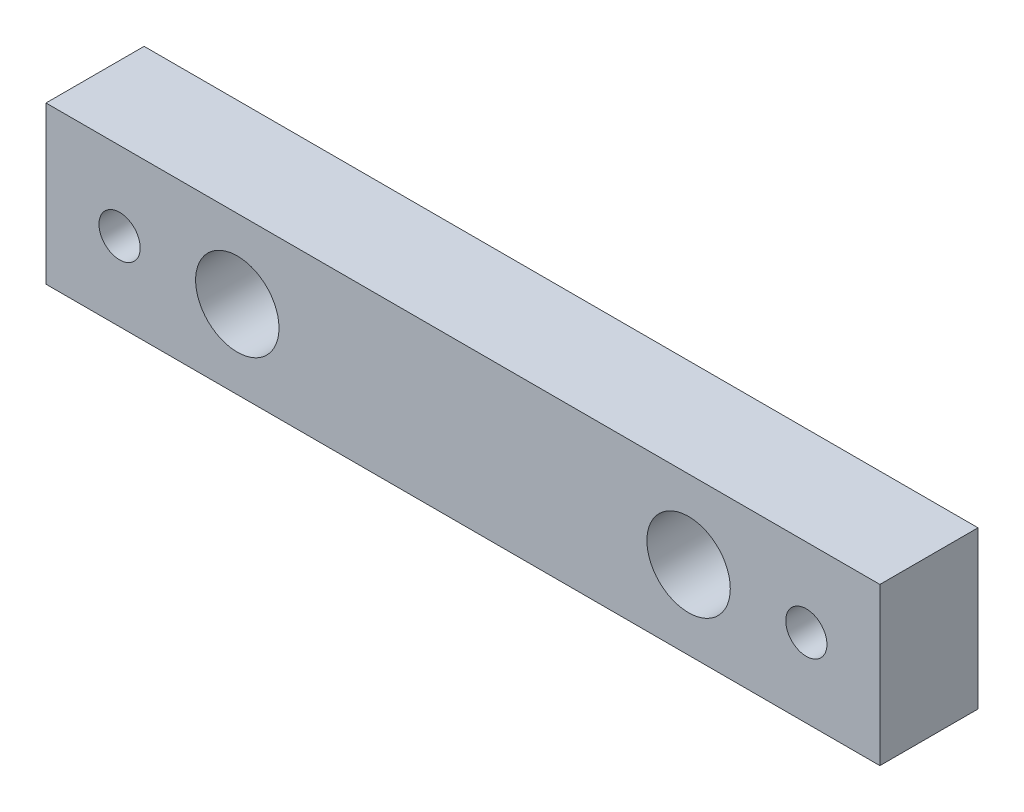
ISO-10303-21;
HEADER;
FILE_DESCRIPTION(('STEP AP214'),'2;1');
FILE_NAME('part.step','',(''),(''),'','','');
FILE_SCHEMA(('AUTOMOTIVE_DESIGN { 1 0 10303 214 1 1 1 1 }'));
ENDSEC;
DATA;
#1=APPLICATION_CONTEXT('core data for automotive mechanical design processes');
#2=APPLICATION_PROTOCOL_DEFINITION('international standard','automotive_design',2000,#1);
#3=PRODUCT_CONTEXT('',#1,'mechanical');
#4=PRODUCT('Part','Part','',(#3));
#5=PRODUCT_RELATED_PRODUCT_CATEGORY('part','',(#4));
#6=PRODUCT_DEFINITION_FORMATION('','',#4);
#7=PRODUCT_DEFINITION_CONTEXT('part definition',#1,'design');
#8=PRODUCT_DEFINITION('design','',#6,#7);
#9=PRODUCT_DEFINITION_SHAPE('','',#8);
#10=(LENGTH_UNIT() NAMED_UNIT(*) SI_UNIT(.MILLI.,.METRE.));
#11=(NAMED_UNIT(*) PLANE_ANGLE_UNIT() SI_UNIT($,.RADIAN.));
#12=(NAMED_UNIT(*) SI_UNIT($,.STERADIAN.) SOLID_ANGLE_UNIT());
#13=UNCERTAINTY_MEASURE_WITH_UNIT(LENGTH_MEASURE(1.E-05),#10,'distance_accuracy_value','');
#14=(GEOMETRIC_REPRESENTATION_CONTEXT(3) GLOBAL_UNCERTAINTY_ASSIGNED_CONTEXT((#13)) GLOBAL_UNIT_ASSIGNED_CONTEXT((#10,
#11,#12)) REPRESENTATION_CONTEXT('',''));
#15=CARTESIAN_POINT('',(0.,0.,0.));
#16=DIRECTION('',(0.,0.,1.));
#17=DIRECTION('',(1.,0.,0.));
#18=AXIS2_PLACEMENT_3D('',#15,#16,#17);
#19=CARTESIAN_POINT('',(0.,0.,10.));
#20=DIRECTION('',(0.,0.,-1.));
#21=DIRECTION('',(-1.,0.,0.));
#22=AXIS2_PLACEMENT_3D('',#19,#20,#21);
#23=PLANE('',#22);
#24=CARTESIAN_POINT('',(-35.,0.,10.));
#25=DIRECTION('',(0.,0.,1.));
#26=DIRECTION('',(1.,0.,0.));
#27=AXIS2_PLACEMENT_3D('',#24,#25,#26);
#28=CIRCLE('',#27,2.09999999999999);
#29=CARTESIAN_POINT('',(-32.9,0.,10.));
#30=VERTEX_POINT('',#29);
#31=EDGE_CURVE('E132',#30,#30,#28,.T.);
#32=ORIENTED_EDGE('',*,*,#31,.F.);
#33=EDGE_LOOP('',(#32));
#34=FACE_BOUND('',#33,.T.);
#35=CARTESIAN_POINT('',(35.,0.,10.));
#36=DIRECTION('',(0.,0.,1.));
#37=DIRECTION('',(1.,0.,0.));
#38=AXIS2_PLACEMENT_3D('',#35,#36,#37);
#39=CIRCLE('',#38,2.09999999999999);
#40=CARTESIAN_POINT('',(37.1,0.,10.));
#41=VERTEX_POINT('',#40);
#42=EDGE_CURVE('E129',#41,#41,#39,.T.);
#43=ORIENTED_EDGE('',*,*,#42,.F.);
#44=EDGE_LOOP('',(#43));
#45=FACE_BOUND('',#44,.T.);
#46=DIRECTION('',(0.,-1.,0.));
#47=VECTOR('',#46,1.);
#48=CARTESIAN_POINT('',(-42.5,7.99999999999999,10.));
#49=LINE('',#48,#47);
#50=CARTESIAN_POINT('',(-42.5,7.99999999999999,10.));
#51=VERTEX_POINT('',#50);
#52=CARTESIAN_POINT('',(-42.5,-8.00000000000001,10.));
#53=VERTEX_POINT('',#52);
#54=EDGE_CURVE('E87',#51,#53,#49,.T.);
#55=ORIENTED_EDGE('',*,*,#54,.T.);
#56=DIRECTION('',(1.,0.,0.));
#57=VECTOR('',#56,1.);
#58=CARTESIAN_POINT('',(42.5,-7.99999999999999,10.));
#59=LINE('',#58,#57);
#60=CARTESIAN_POINT('',(42.5,-7.99999999999999,10.));
#61=VERTEX_POINT('',#60);
#62=EDGE_CURVE('E82',#53,#61,#59,.T.);
#63=ORIENTED_EDGE('',*,*,#62,.T.);
#64=DIRECTION('',(0.,1.,0.));
#65=VECTOR('',#64,1.);
#66=CARTESIAN_POINT('',(42.5,8.00000000000001,10.));
#67=LINE('',#66,#65);
#68=CARTESIAN_POINT('',(42.5,8.00000000000001,10.));
#69=VERTEX_POINT('',#68);
#70=EDGE_CURVE('E85',#61,#69,#67,.T.);
#71=ORIENTED_EDGE('',*,*,#70,.T.);
#72=DIRECTION('',(-1.,0.,0.));
#73=VECTOR('',#72,1.);
#74=CARTESIAN_POINT('',(42.5,8.00000000000001,10.));
#75=LINE('',#74,#73);
#76=EDGE_CURVE('E52',#69,#51,#75,.T.);
#77=ORIENTED_EDGE('',*,*,#76,.T.);
#78=EDGE_LOOP('',(#55,#63,#71,#77));
#79=FACE_BOUND('',#78,.T.);
#80=CARTESIAN_POINT('',(-23.,0.,10.));
#81=DIRECTION('',(0.,0.,1.));
#82=DIRECTION('',(1.,0.,0.));
#83=AXIS2_PLACEMENT_3D('',#80,#81,#82);
#84=CIRCLE('',#83,4.25);
#85=CARTESIAN_POINT('',(-18.75,0.,10.));
#86=VERTEX_POINT('',#85);
#87=EDGE_CURVE('E103',#86,#86,#84,.T.);
#88=ORIENTED_EDGE('',*,*,#87,.F.);
#89=EDGE_LOOP('',(#88));
#90=FACE_BOUND('',#89,.T.);
#91=CARTESIAN_POINT('',(23.,0.,10.));
#92=DIRECTION('',(0.,0.,1.));
#93=DIRECTION('',(1.,0.,0.));
#94=AXIS2_PLACEMENT_3D('',#91,#92,#93);
#95=CIRCLE('',#94,4.25);
#96=CARTESIAN_POINT('',(27.25,0.,10.));
#97=VERTEX_POINT('',#96);
#98=EDGE_CURVE('E118',#97,#97,#95,.T.);
#99=ORIENTED_EDGE('',*,*,#98,.F.);
#100=EDGE_LOOP('',(#99));
#101=FACE_BOUND('',#100,.T.);
#102=ADVANCED_FACE('F34',(#34,#45,#79,#90,#101),#23,.F.);
#103=CARTESIAN_POINT('',(0.,0.,0.));
#104=DIRECTION('',(0.,0.,-1.));
#105=DIRECTION('',(-1.,0.,0.));
#106=AXIS2_PLACEMENT_3D('',#103,#104,#105);
#107=PLANE('',#106);
#108=CARTESIAN_POINT('',(-35.,0.,0.));
#109=DIRECTION('',(0.,0.,-1.));
#110=DIRECTION('',(-1.,0.,0.));
#111=AXIS2_PLACEMENT_3D('',#108,#109,#110);
#112=CIRCLE('',#111,2.09999999999999);
#113=CARTESIAN_POINT('',(-37.1,0.,0.));
#114=VERTEX_POINT('',#113);
#115=EDGE_CURVE('E38',#114,#114,#112,.T.);
#116=ORIENTED_EDGE('',*,*,#115,.F.);
#117=EDGE_LOOP('',(#116));
#118=FACE_BOUND('',#117,.T.);
#119=CARTESIAN_POINT('',(35.,0.,0.));
#120=DIRECTION('',(0.,0.,-1.));
#121=DIRECTION('',(-1.,0.,0.));
#122=AXIS2_PLACEMENT_3D('',#119,#120,#121);
#123=CIRCLE('',#122,2.09999999999999);
#124=CARTESIAN_POINT('',(32.9,0.,0.));
#125=VERTEX_POINT('',#124);
#126=EDGE_CURVE('E124',#125,#125,#123,.T.);
#127=ORIENTED_EDGE('',*,*,#126,.F.);
#128=EDGE_LOOP('',(#127));
#129=FACE_BOUND('',#128,.T.);
#130=CARTESIAN_POINT('',(-23.,0.,0.));
#131=DIRECTION('',(0.,0.,1.));
#132=DIRECTION('',(1.,0.,0.));
#133=AXIS2_PLACEMENT_3D('',#130,#131,#132);
#134=CIRCLE('',#133,4.25);
#135=CARTESIAN_POINT('',(-18.75,0.,0.));
#136=VERTEX_POINT('',#135);
#137=EDGE_CURVE('E115',#136,#136,#134,.T.);
#138=ORIENTED_EDGE('',*,*,#137,.T.);
#139=EDGE_LOOP('',(#138));
#140=FACE_BOUND('',#139,.T.);
#141=DIRECTION('',(0.,-1.,0.));
#142=VECTOR('',#141,1.);
#143=CARTESIAN_POINT('',(-42.5,7.99999999999999,0.));
#144=LINE('',#143,#142);
#145=CARTESIAN_POINT('',(-42.5,7.99999999999999,0.));
#146=VERTEX_POINT('',#145);
#147=CARTESIAN_POINT('',(-42.5,-8.00000000000001,0.));
#148=VERTEX_POINT('',#147);
#149=EDGE_CURVE('E100',#146,#148,#144,.T.);
#150=ORIENTED_EDGE('',*,*,#149,.F.);
#151=DIRECTION('',(-1.,0.,0.));
#152=VECTOR('',#151,1.);
#153=CARTESIAN_POINT('',(42.5,8.00000000000001,0.));
#154=LINE('',#153,#152);
#155=CARTESIAN_POINT('',(42.5,8.00000000000001,0.));
#156=VERTEX_POINT('',#155);
#157=EDGE_CURVE('E75',#156,#146,#154,.T.);
#158=ORIENTED_EDGE('',*,*,#157,.F.);
#159=DIRECTION('',(0.,1.,0.));
#160=VECTOR('',#159,1.);
#161=CARTESIAN_POINT('',(42.5,8.00000000000001,0.));
#162=LINE('',#161,#160);
#163=CARTESIAN_POINT('',(42.5,-7.99999999999999,0.));
#164=VERTEX_POINT('',#163);
#165=EDGE_CURVE('E69',#164,#156,#162,.T.);
#166=ORIENTED_EDGE('',*,*,#165,.F.);
#167=DIRECTION('',(1.,0.,0.));
#168=VECTOR('',#167,1.);
#169=CARTESIAN_POINT('',(42.5,-7.99999999999999,0.));
#170=LINE('',#169,#168);
#171=EDGE_CURVE('E91',#148,#164,#170,.T.);
#172=ORIENTED_EDGE('',*,*,#171,.F.);
#173=EDGE_LOOP('',(#150,#158,#166,#172));
#174=FACE_BOUND('',#173,.T.);
#175=CARTESIAN_POINT('',(23.,0.,0.));
#176=DIRECTION('',(0.,0.,1.));
#177=DIRECTION('',(1.,0.,0.));
#178=AXIS2_PLACEMENT_3D('',#175,#176,#177);
#179=CIRCLE('',#178,4.25);
#180=CARTESIAN_POINT('',(27.25,0.,0.));
#181=VERTEX_POINT('',#180);
#182=EDGE_CURVE('E121',#181,#181,#179,.T.);
#183=ORIENTED_EDGE('',*,*,#182,.T.);
#184=EDGE_LOOP('',(#183));
#185=FACE_BOUND('',#184,.T.);
#186=ADVANCED_FACE('F111',(#118,#129,#140,#174,#185),#107,.T.);
#187=CARTESIAN_POINT('',(-42.5,7.99999999999999,10.));
#188=DIRECTION('',(1.,0.,0.));
#189=DIRECTION('',(0.,0.,-1.));
#190=AXIS2_PLACEMENT_3D('',#187,#188,#189);
#191=PLANE('',#190);
#192=ORIENTED_EDGE('',*,*,#149,.T.);
#193=DIRECTION('',(0.,0.,-1.));
#194=VECTOR('',#193,1.);
#195=CARTESIAN_POINT('',(-42.5,-8.00000000000001,10.));
#196=LINE('',#195,#194);
#197=EDGE_CURVE('E11',#53,#148,#196,.T.);
#198=ORIENTED_EDGE('',*,*,#197,.F.);
#199=ORIENTED_EDGE('',*,*,#54,.F.);
#200=DIRECTION('',(0.,0.,-1.));
#201=VECTOR('',#200,1.);
#202=CARTESIAN_POINT('',(-42.5,7.99999999999999,10.));
#203=LINE('',#202,#201);
#204=EDGE_CURVE('E96',#51,#146,#203,.T.);
#205=ORIENTED_EDGE('',*,*,#204,.T.);
#206=EDGE_LOOP('',(#192,#198,#199,#205));
#207=FACE_BOUND('',#206,.T.);
#208=ADVANCED_FACE('F36',(#207),#191,.F.);
#209=CARTESIAN_POINT('',(42.5,-7.99999999999999,10.));
#210=DIRECTION('',(0.,1.,0.));
#211=DIRECTION('',(-1.,0.,0.));
#212=AXIS2_PLACEMENT_3D('',#209,#210,#211);
#213=PLANE('',#212);
#214=ORIENTED_EDGE('',*,*,#171,.T.);
#215=DIRECTION('',(0.,0.,-1.));
#216=VECTOR('',#215,1.);
#217=CARTESIAN_POINT('',(42.5,-7.99999999999999,10.));
#218=LINE('',#217,#216);
#219=EDGE_CURVE('E44',#61,#164,#218,.T.);
#220=ORIENTED_EDGE('',*,*,#219,.F.);
#221=ORIENTED_EDGE('',*,*,#62,.F.);
#222=ORIENTED_EDGE('',*,*,#197,.T.);
#223=EDGE_LOOP('',(#214,#220,#221,#222));
#224=FACE_BOUND('',#223,.T.);
#225=ADVANCED_FACE('F90',(#224),#213,.F.);
#226=CARTESIAN_POINT('',(42.5,8.00000000000001,10.));
#227=DIRECTION('',(-1.,0.,0.));
#228=DIRECTION('',(0.,0.,1.));
#229=AXIS2_PLACEMENT_3D('',#226,#227,#228);
#230=PLANE('',#229);
#231=ORIENTED_EDGE('',*,*,#165,.T.);
#232=DIRECTION('',(0.,0.,-1.));
#233=VECTOR('',#232,1.);
#234=CARTESIAN_POINT('',(42.5,8.00000000000001,10.));
#235=LINE('',#234,#233);
#236=EDGE_CURVE('E92',#69,#156,#235,.T.);
#237=ORIENTED_EDGE('',*,*,#236,.F.);
#238=ORIENTED_EDGE('',*,*,#70,.F.);
#239=ORIENTED_EDGE('',*,*,#219,.T.);
#240=EDGE_LOOP('',(#231,#237,#238,#239));
#241=FACE_BOUND('',#240,.T.);
#242=ADVANCED_FACE('F94',(#241),#230,.F.);
#243=CARTESIAN_POINT('',(42.5,8.00000000000001,10.));
#244=DIRECTION('',(0.,-1.,0.));
#245=DIRECTION('',(1.,0.,0.));
#246=AXIS2_PLACEMENT_3D('',#243,#244,#245);
#247=PLANE('',#246);
#248=ORIENTED_EDGE('',*,*,#157,.T.);
#249=ORIENTED_EDGE('',*,*,#204,.F.);
#250=ORIENTED_EDGE('',*,*,#76,.F.);
#251=ORIENTED_EDGE('',*,*,#236,.T.);
#252=EDGE_LOOP('',(#248,#249,#250,#251));
#253=FACE_BOUND('',#252,.T.);
#254=ADVANCED_FACE('F108',(#253),#247,.F.);
#255=CARTESIAN_POINT('',(-23.,0.,10.));
#256=DIRECTION('',(0.,0.,-1.));
#257=DIRECTION('',(-1.,0.,0.));
#258=AXIS2_PLACEMENT_3D('',#255,#256,#257);
#259=CYLINDRICAL_SURFACE('',#258,4.25);
#260=ORIENTED_EDGE('',*,*,#87,.T.);
#261=EDGE_LOOP('',(#260));
#262=FACE_BOUND('',#261,.T.);
#263=ORIENTED_EDGE('',*,*,#137,.F.);
#264=EDGE_LOOP('',(#263));
#265=FACE_BOUND('',#264,.T.);
#266=ADVANCED_FACE('F148',(#262,#265),#259,.F.);
#267=CARTESIAN_POINT('',(23.,0.,10.));
#268=DIRECTION('',(0.,0.,-1.));
#269=DIRECTION('',(-1.,0.,0.));
#270=AXIS2_PLACEMENT_3D('',#267,#268,#269);
#271=CYLINDRICAL_SURFACE('',#270,4.25);
#272=ORIENTED_EDGE('',*,*,#98,.T.);
#273=EDGE_LOOP('',(#272));
#274=FACE_BOUND('',#273,.T.);
#275=ORIENTED_EDGE('',*,*,#182,.F.);
#276=EDGE_LOOP('',(#275));
#277=FACE_BOUND('',#276,.T.);
#278=ADVANCED_FACE('F150',(#274,#277),#271,.F.);
#279=CARTESIAN_POINT('',(35.,0.,10.));
#280=DIRECTION('',(0.,0.,1.));
#281=DIRECTION('',(1.,0.,0.));
#282=AXIS2_PLACEMENT_3D('',#279,#280,#281);
#283=CYLINDRICAL_SURFACE('',#282,2.09999999999999);
#284=ORIENTED_EDGE('',*,*,#126,.T.);
#285=EDGE_LOOP('',(#284));
#286=FACE_BOUND('',#285,.T.);
#287=ORIENTED_EDGE('',*,*,#42,.T.);
#288=EDGE_LOOP('',(#287));
#289=FACE_BOUND('',#288,.T.);
#290=ADVANCED_FACE('F157',(#286,#289),#283,.F.);
#291=CARTESIAN_POINT('',(-35.,0.,10.));
#292=DIRECTION('',(0.,0.,1.));
#293=DIRECTION('',(1.,0.,0.));
#294=AXIS2_PLACEMENT_3D('',#291,#292,#293);
#295=CYLINDRICAL_SURFACE('',#294,2.09999999999999);
#296=ORIENTED_EDGE('',*,*,#115,.T.);
#297=EDGE_LOOP('',(#296));
#298=FACE_BOUND('',#297,.T.);
#299=ORIENTED_EDGE('',*,*,#31,.T.);
#300=EDGE_LOOP('',(#299));
#301=FACE_BOUND('',#300,.T.);
#302=ADVANCED_FACE('F139',(#298,#301),#295,.F.);
#303=CLOSED_SHELL('',(#102,#186,#208,#225,#242,#254,#266,#278,#290,#302));
#304=MANIFOLD_SOLID_BREP('B2',#303);
#305=ADVANCED_BREP_SHAPE_REPRESENTATION('',(#18,#304),#14);
#306=SHAPE_DEFINITION_REPRESENTATION(#9,#305);
ENDSEC;
END-ISO-10303-21;
